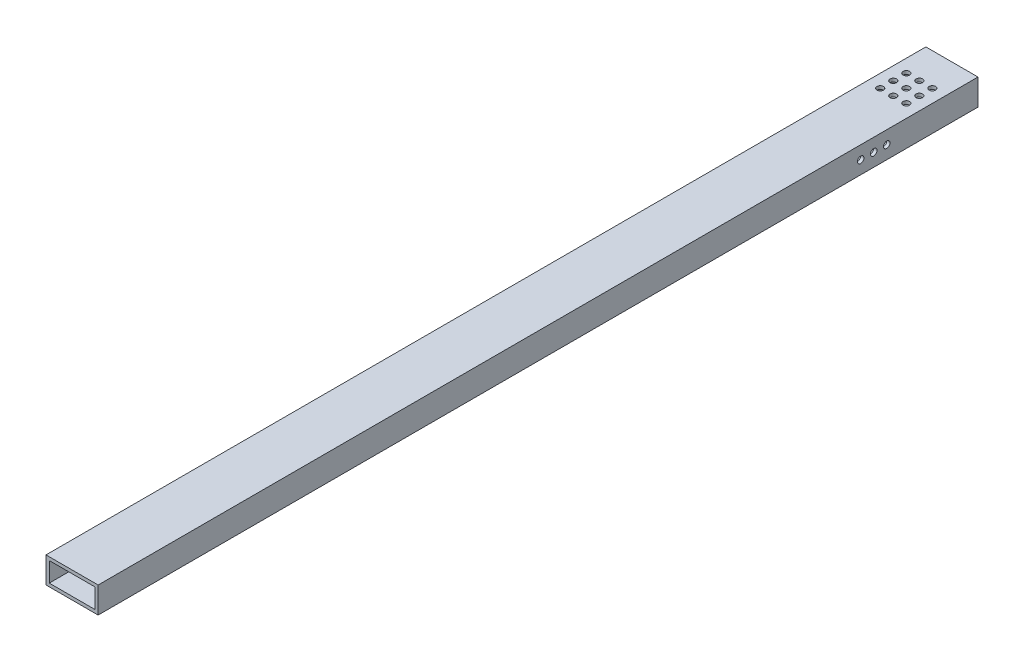
ISO-10303-21;
HEADER;
FILE_DESCRIPTION(('STEP AP214'),'2;1');
FILE_NAME('part.step','',(''),(''),'','','');
FILE_SCHEMA(('AUTOMOTIVE_DESIGN { 1 0 10303 214 1 1 1 1 }'));
ENDSEC;
DATA;
#1=APPLICATION_CONTEXT('core data for automotive mechanical design processes');
#2=APPLICATION_PROTOCOL_DEFINITION('international standard','automotive_design',2000,#1);
#3=PRODUCT_CONTEXT('',#1,'mechanical');
#4=PRODUCT('Part','Part','',(#3));
#5=PRODUCT_RELATED_PRODUCT_CATEGORY('part','',(#4));
#6=PRODUCT_DEFINITION_FORMATION('','',#4);
#7=PRODUCT_DEFINITION_CONTEXT('part definition',#1,'design');
#8=PRODUCT_DEFINITION('design','',#6,#7);
#9=PRODUCT_DEFINITION_SHAPE('','',#8);
#10=(LENGTH_UNIT() NAMED_UNIT(*) SI_UNIT(.MILLI.,.METRE.));
#11=(NAMED_UNIT(*) PLANE_ANGLE_UNIT() SI_UNIT($,.RADIAN.));
#12=(NAMED_UNIT(*) SI_UNIT($,.STERADIAN.) SOLID_ANGLE_UNIT());
#13=UNCERTAINTY_MEASURE_WITH_UNIT(LENGTH_MEASURE(1.E-05),#10,'distance_accuracy_value','');
#14=(GEOMETRIC_REPRESENTATION_CONTEXT(3) GLOBAL_UNCERTAINTY_ASSIGNED_CONTEXT((#13)) GLOBAL_UNIT_ASSIGNED_CONTEXT((#10,
#11,#12)) REPRESENTATION_CONTEXT('',''));
#15=CARTESIAN_POINT('',(0.,0.,0.));
#16=DIRECTION('',(0.,0.,1.));
#17=DIRECTION('',(1.,0.,0.));
#18=AXIS2_PLACEMENT_3D('',#15,#16,#17);
#19=CARTESIAN_POINT('',(0.,0.,857.25));
#20=DIRECTION('',(0.,0.,-1.));
#21=DIRECTION('',(-1.,0.,0.));
#22=AXIS2_PLACEMENT_3D('',#19,#20,#21);
#23=PLANE('',#22);
#24=DIRECTION('',(0.,-1.,0.));
#25=VECTOR('',#24,1.);
#26=CARTESIAN_POINT('',(0.,0.,857.25));
#27=LINE('',#26,#25);
#28=CARTESIAN_POINT('',(0.,25.4,857.25));
#29=VERTEX_POINT('',#28);
#30=CARTESIAN_POINT('',(0.,0.,857.25));
#31=VERTEX_POINT('',#30);
#32=EDGE_CURVE('E144',#29,#31,#27,.T.);
#33=ORIENTED_EDGE('',*,*,#32,.T.);
#34=DIRECTION('',(1.,0.,0.));
#35=VECTOR('',#34,1.);
#36=CARTESIAN_POINT('',(0.,0.,857.25));
#37=LINE('',#36,#35);
#38=CARTESIAN_POINT('',(50.8,0.,857.25));
#39=VERTEX_POINT('',#38);
#40=EDGE_CURVE('E147',#31,#39,#37,.T.);
#41=ORIENTED_EDGE('',*,*,#40,.T.);
#42=DIRECTION('',(0.,1.,0.));
#43=VECTOR('',#42,1.);
#44=CARTESIAN_POINT('',(50.8,0.,857.25));
#45=LINE('',#44,#43);
#46=CARTESIAN_POINT('',(50.8,25.4,857.25));
#47=VERTEX_POINT('',#46);
#48=EDGE_CURVE('E150',#39,#47,#45,.T.);
#49=ORIENTED_EDGE('',*,*,#48,.T.);
#50=DIRECTION('',(-1.,0.,0.));
#51=VECTOR('',#50,1.);
#52=CARTESIAN_POINT('',(0.,25.4,857.25));
#53=LINE('',#52,#51);
#54=EDGE_CURVE('E152',#47,#29,#53,.T.);
#55=ORIENTED_EDGE('',*,*,#54,.T.);
#56=EDGE_LOOP('',(#33,#41,#49,#55));
#57=FACE_BOUND('',#56,.T.);
#58=DIRECTION('',(0.,-1.,0.));
#59=VECTOR('',#58,1.);
#60=CARTESIAN_POINT('',(3.175,3.175,857.25));
#61=LINE('',#60,#59);
#62=CARTESIAN_POINT('',(3.175,22.225,857.25));
#63=VERTEX_POINT('',#62);
#64=CARTESIAN_POINT('',(3.175,3.175,857.25));
#65=VERTEX_POINT('',#64);
#66=EDGE_CURVE('E106',#63,#65,#61,.T.);
#67=ORIENTED_EDGE('',*,*,#66,.F.);
#68=DIRECTION('',(-1.,0.,0.));
#69=VECTOR('',#68,1.);
#70=CARTESIAN_POINT('',(3.175,22.225,857.25));
#71=LINE('',#70,#69);
#72=CARTESIAN_POINT('',(47.625,22.225,857.25));
#73=VERTEX_POINT('',#72);
#74=EDGE_CURVE('E128',#73,#63,#71,.T.);
#75=ORIENTED_EDGE('',*,*,#74,.F.);
#76=DIRECTION('',(0.,1.,0.));
#77=VECTOR('',#76,1.);
#78=CARTESIAN_POINT('',(47.625,3.175,857.25));
#79=LINE('',#78,#77);
#80=CARTESIAN_POINT('',(47.625,3.175,857.25));
#81=VERTEX_POINT('',#80);
#82=EDGE_CURVE('E126',#81,#73,#79,.T.);
#83=ORIENTED_EDGE('',*,*,#82,.F.);
#84=DIRECTION('',(1.,0.,0.));
#85=VECTOR('',#84,1.);
#86=CARTESIAN_POINT('',(3.175,3.175,857.25));
#87=LINE('',#86,#85);
#88=EDGE_CURVE('E114',#65,#81,#87,.T.);
#89=ORIENTED_EDGE('',*,*,#88,.F.);
#90=EDGE_LOOP('',(#67,#75,#83,#89));
#91=FACE_BOUND('',#90,.T.);
#92=ADVANCED_FACE('F39',(#57,#91),#23,.F.);
#93=CARTESIAN_POINT('',(0.,0.,0.));
#94=DIRECTION('',(0.,0.,-1.));
#95=DIRECTION('',(-1.,0.,0.));
#96=AXIS2_PLACEMENT_3D('',#93,#94,#95);
#97=PLANE('',#96);
#98=DIRECTION('',(0.,-1.,0.));
#99=VECTOR('',#98,1.);
#100=CARTESIAN_POINT('',(0.,0.,0.));
#101=LINE('',#100,#99);
#102=CARTESIAN_POINT('',(0.,25.4,0.));
#103=VERTEX_POINT('',#102);
#104=CARTESIAN_POINT('',(0.,0.,0.));
#105=VERTEX_POINT('',#104);
#106=EDGE_CURVE('E122',#103,#105,#101,.T.);
#107=ORIENTED_EDGE('',*,*,#106,.F.);
#108=DIRECTION('',(-1.,0.,0.));
#109=VECTOR('',#108,1.);
#110=CARTESIAN_POINT('',(0.,25.4,0.));
#111=LINE('',#110,#109);
#112=CARTESIAN_POINT('',(50.8,25.4,0.));
#113=VERTEX_POINT('',#112);
#114=EDGE_CURVE('E148',#113,#103,#111,.T.);
#115=ORIENTED_EDGE('',*,*,#114,.F.);
#116=DIRECTION('',(0.,1.,0.));
#117=VECTOR('',#116,1.);
#118=CARTESIAN_POINT('',(50.8,0.,0.));
#119=LINE('',#118,#117);
#120=CARTESIAN_POINT('',(50.8,0.,0.));
#121=VERTEX_POINT('',#120);
#122=EDGE_CURVE('E159',#121,#113,#119,.T.);
#123=ORIENTED_EDGE('',*,*,#122,.F.);
#124=DIRECTION('',(1.,0.,0.));
#125=VECTOR('',#124,1.);
#126=CARTESIAN_POINT('',(0.,0.,0.));
#127=LINE('',#126,#125);
#128=EDGE_CURVE('E157',#105,#121,#127,.T.);
#129=ORIENTED_EDGE('',*,*,#128,.F.);
#130=EDGE_LOOP('',(#107,#115,#123,#129));
#131=FACE_BOUND('',#130,.T.);
#132=DIRECTION('',(-1.,0.,0.));
#133=VECTOR('',#132,1.);
#134=CARTESIAN_POINT('',(3.175,22.225,0.));
#135=LINE('',#134,#133);
#136=CARTESIAN_POINT('',(47.625,22.225,0.));
#137=VERTEX_POINT('',#136);
#138=CARTESIAN_POINT('',(3.175,22.225,0.));
#139=VERTEX_POINT('',#138);
#140=EDGE_CURVE('E115',#137,#139,#135,.T.);
#141=ORIENTED_EDGE('',*,*,#140,.T.);
#142=DIRECTION('',(0.,-1.,0.));
#143=VECTOR('',#142,1.);
#144=CARTESIAN_POINT('',(3.175,3.175,0.));
#145=LINE('',#144,#143);
#146=CARTESIAN_POINT('',(3.175,3.175,0.));
#147=VERTEX_POINT('',#146);
#148=EDGE_CURVE('E64',#139,#147,#145,.T.);
#149=ORIENTED_EDGE('',*,*,#148,.T.);
#150=DIRECTION('',(1.,0.,0.));
#151=VECTOR('',#150,1.);
#152=CARTESIAN_POINT('',(3.175,3.175,0.));
#153=LINE('',#152,#151);
#154=CARTESIAN_POINT('',(47.625,3.175,0.));
#155=VERTEX_POINT('',#154);
#156=EDGE_CURVE('E121',#147,#155,#153,.T.);
#157=ORIENTED_EDGE('',*,*,#156,.T.);
#158=DIRECTION('',(0.,1.,0.));
#159=VECTOR('',#158,1.);
#160=CARTESIAN_POINT('',(47.625,3.175,0.));
#161=LINE('',#160,#159);
#162=EDGE_CURVE('E136',#155,#137,#161,.T.);
#163=ORIENTED_EDGE('',*,*,#162,.T.);
#164=EDGE_LOOP('',(#141,#149,#157,#163));
#165=FACE_BOUND('',#164,.T.);
#166=ADVANCED_FACE('F272',(#131,#165),#97,.T.);
#167=CARTESIAN_POINT('',(0.,0.,857.25));
#168=DIRECTION('',(1.,0.,0.));
#169=DIRECTION('',(0.,0.,-1.));
#170=AXIS2_PLACEMENT_3D('',#167,#168,#169);
#171=PLANE('',#170);
#172=CARTESIAN_POINT('',(0.,12.7,88.9));
#173=DIRECTION('',(1.,0.,0.));
#174=DIRECTION('',(0.,0.,-1.));
#175=AXIS2_PLACEMENT_3D('',#172,#173,#174);
#176=CIRCLE('',#175,3.175);
#177=CARTESIAN_POINT('',(0.,12.7,85.725));
#178=VERTEX_POINT('',#177);
#179=EDGE_CURVE('E173',#178,#178,#176,.T.);
#180=ORIENTED_EDGE('',*,*,#179,.T.);
#181=EDGE_LOOP('',(#180));
#182=FACE_BOUND('',#181,.T.);
#183=CARTESIAN_POINT('',(0.,12.6999999999999,101.6));
#184=DIRECTION('',(1.,0.,0.));
#185=DIRECTION('',(0.,0.,-1.));
#186=AXIS2_PLACEMENT_3D('',#183,#184,#185);
#187=CIRCLE('',#186,3.175);
#188=CARTESIAN_POINT('',(0.,12.6999999999999,98.425));
#189=VERTEX_POINT('',#188);
#190=EDGE_CURVE('E235',#189,#189,#187,.T.);
#191=ORIENTED_EDGE('',*,*,#190,.T.);
#192=EDGE_LOOP('',(#191));
#193=FACE_BOUND('',#192,.T.);
#194=CARTESIAN_POINT('',(0.,12.6999999999998,114.3));
#195=DIRECTION('',(1.,0.,0.));
#196=DIRECTION('',(0.,0.,-1.));
#197=AXIS2_PLACEMENT_3D('',#194,#195,#196);
#198=CIRCLE('',#197,3.175);
#199=CARTESIAN_POINT('',(0.,12.6999999999998,111.125));
#200=VERTEX_POINT('',#199);
#201=EDGE_CURVE('E226',#200,#200,#198,.T.);
#202=ORIENTED_EDGE('',*,*,#201,.T.);
#203=EDGE_LOOP('',(#202));
#204=FACE_BOUND('',#203,.T.);
#205=ORIENTED_EDGE('',*,*,#106,.T.);
#206=DIRECTION('',(0.,0.,-1.));
#207=VECTOR('',#206,1.);
#208=CARTESIAN_POINT('',(0.,0.,857.25));
#209=LINE('',#208,#207);
#210=EDGE_CURVE('E11',#31,#105,#209,.T.);
#211=ORIENTED_EDGE('',*,*,#210,.F.);
#212=ORIENTED_EDGE('',*,*,#32,.F.);
#213=DIRECTION('',(0.,0.,-1.));
#214=VECTOR('',#213,1.);
#215=CARTESIAN_POINT('',(0.,25.4,857.25));
#216=LINE('',#215,#214);
#217=EDGE_CURVE('E154',#29,#103,#216,.T.);
#218=ORIENTED_EDGE('',*,*,#217,.T.);
#219=EDGE_LOOP('',(#205,#211,#212,#218));
#220=FACE_BOUND('',#219,.T.);
#221=ADVANCED_FACE('F41',(#182,#193,#204,#220),#171,.F.);
#222=CARTESIAN_POINT('',(0.,0.,857.25));
#223=DIRECTION('',(0.,1.,0.));
#224=DIRECTION('',(0.,0.,1.));
#225=AXIS2_PLACEMENT_3D('',#222,#223,#224);
#226=PLANE('',#225);
#227=CARTESIAN_POINT('',(25.4,0.,31.75));
#228=DIRECTION('',(0.,1.,0.));
#229=DIRECTION('',(0.,0.,1.));
#230=AXIS2_PLACEMENT_3D('',#227,#228,#229);
#231=CIRCLE('',#230,3.175);
#232=CARTESIAN_POINT('',(25.4,0.,34.925));
#233=VERTEX_POINT('',#232);
#234=EDGE_CURVE('E419',#233,#233,#231,.T.);
#235=ORIENTED_EDGE('',*,*,#234,.T.);
#236=EDGE_LOOP('',(#235));
#237=FACE_BOUND('',#236,.T.);
#238=CARTESIAN_POINT('',(38.1,0.,31.75));
#239=DIRECTION('',(0.,1.,0.));
#240=DIRECTION('',(0.,0.,1.));
#241=AXIS2_PLACEMENT_3D('',#238,#239,#240);
#242=CIRCLE('',#241,3.175);
#243=CARTESIAN_POINT('',(38.1,0.,34.925));
#244=VERTEX_POINT('',#243);
#245=EDGE_CURVE('E425',#244,#244,#242,.T.);
#246=ORIENTED_EDGE('',*,*,#245,.T.);
#247=EDGE_LOOP('',(#246));
#248=FACE_BOUND('',#247,.T.);
#249=CARTESIAN_POINT('',(25.4,0.,44.45));
#250=DIRECTION('',(0.,1.,0.));
#251=DIRECTION('',(0.,0.,1.));
#252=AXIS2_PLACEMENT_3D('',#249,#250,#251);
#253=CIRCLE('',#252,3.175);
#254=CARTESIAN_POINT('',(25.4,0.,47.625));
#255=VERTEX_POINT('',#254);
#256=EDGE_CURVE('E431',#255,#255,#253,.T.);
#257=ORIENTED_EDGE('',*,*,#256,.T.);
#258=EDGE_LOOP('',(#257));
#259=FACE_BOUND('',#258,.T.);
#260=CARTESIAN_POINT('',(38.1,0.,44.45));
#261=DIRECTION('',(0.,1.,0.));
#262=DIRECTION('',(0.,0.,1.));
#263=AXIS2_PLACEMENT_3D('',#260,#261,#262);
#264=CIRCLE('',#263,3.175);
#265=CARTESIAN_POINT('',(38.1,0.,47.625));
#266=VERTEX_POINT('',#265);
#267=EDGE_CURVE('E395',#266,#266,#264,.T.);
#268=ORIENTED_EDGE('',*,*,#267,.T.);
#269=EDGE_LOOP('',(#268));
#270=FACE_BOUND('',#269,.T.);
#271=CARTESIAN_POINT('',(25.4,0.,57.15));
#272=DIRECTION('',(0.,1.,0.));
#273=DIRECTION('',(0.,0.,1.));
#274=AXIS2_PLACEMENT_3D('',#271,#272,#273);
#275=CIRCLE('',#274,3.17500000000001);
#276=CARTESIAN_POINT('',(25.4,0.,60.325));
#277=VERTEX_POINT('',#276);
#278=EDGE_CURVE('E389',#277,#277,#275,.T.);
#279=ORIENTED_EDGE('',*,*,#278,.T.);
#280=EDGE_LOOP('',(#279));
#281=FACE_BOUND('',#280,.T.);
#282=CARTESIAN_POINT('',(38.1,0.,57.15));
#283=DIRECTION('',(0.,1.,0.));
#284=DIRECTION('',(0.,0.,1.));
#285=AXIS2_PLACEMENT_3D('',#282,#283,#284);
#286=CIRCLE('',#285,3.175);
#287=CARTESIAN_POINT('',(38.1,0.,60.325));
#288=VERTEX_POINT('',#287);
#289=EDGE_CURVE('E398',#288,#288,#286,.T.);
#290=ORIENTED_EDGE('',*,*,#289,.T.);
#291=EDGE_LOOP('',(#290));
#292=FACE_BOUND('',#291,.T.);
#293=CARTESIAN_POINT('',(12.7,0.,44.45));
#294=DIRECTION('',(0.,1.,0.));
#295=DIRECTION('',(0.,0.,1.));
#296=AXIS2_PLACEMENT_3D('',#293,#294,#295);
#297=CIRCLE('',#296,3.175);
#298=CARTESIAN_POINT('',(12.7,0.,47.625));
#299=VERTEX_POINT('',#298);
#300=EDGE_CURVE('E406',#299,#299,#297,.T.);
#301=ORIENTED_EDGE('',*,*,#300,.T.);
#302=EDGE_LOOP('',(#301));
#303=FACE_BOUND('',#302,.T.);
#304=CARTESIAN_POINT('',(12.7,0.,57.15));
#305=DIRECTION('',(0.,1.,0.));
#306=DIRECTION('',(0.,0.,1.));
#307=AXIS2_PLACEMENT_3D('',#304,#305,#306);
#308=CIRCLE('',#307,3.175);
#309=CARTESIAN_POINT('',(12.7,0.,60.325));
#310=VERTEX_POINT('',#309);
#311=EDGE_CURVE('E412',#310,#310,#308,.T.);
#312=ORIENTED_EDGE('',*,*,#311,.T.);
#313=EDGE_LOOP('',(#312));
#314=FACE_BOUND('',#313,.T.);
#315=CARTESIAN_POINT('',(12.7,0.,31.75));
#316=DIRECTION('',(0.,1.,0.));
#317=DIRECTION('',(0.,0.,1.));
#318=AXIS2_PLACEMENT_3D('',#315,#316,#317);
#319=CIRCLE('',#318,3.175);
#320=CARTESIAN_POINT('',(12.7,0.,34.925));
#321=VERTEX_POINT('',#320);
#322=EDGE_CURVE('E185',#321,#321,#319,.T.);
#323=ORIENTED_EDGE('',*,*,#322,.T.);
#324=EDGE_LOOP('',(#323));
#325=FACE_BOUND('',#324,.T.);
#326=ORIENTED_EDGE('',*,*,#128,.T.);
#327=DIRECTION('',(0.,0.,-1.));
#328=VECTOR('',#327,1.);
#329=CARTESIAN_POINT('',(50.8,0.,857.25));
#330=LINE('',#329,#328);
#331=EDGE_CURVE('E48',#39,#121,#330,.T.);
#332=ORIENTED_EDGE('',*,*,#331,.F.);
#333=ORIENTED_EDGE('',*,*,#40,.F.);
#334=ORIENTED_EDGE('',*,*,#210,.T.);
#335=EDGE_LOOP('',(#326,#332,#333,#334));
#336=FACE_BOUND('',#335,.T.);
#337=ADVANCED_FACE('F271',(#237,#248,#259,#270,#281,#292,#303,#314,#325,#336),#226,.F.);
#338=CARTESIAN_POINT('',(50.8,0.,857.25));
#339=DIRECTION('',(-1.,0.,0.));
#340=DIRECTION('',(0.,0.,1.));
#341=AXIS2_PLACEMENT_3D('',#338,#339,#340);
#342=PLANE('',#341);
#343=CARTESIAN_POINT('',(50.8,12.7,88.9));
#344=DIRECTION('',(1.,0.,0.));
#345=DIRECTION('',(0.,0.,-1.));
#346=AXIS2_PLACEMENT_3D('',#343,#344,#345);
#347=CIRCLE('',#346,3.175);
#348=CARTESIAN_POINT('',(50.8,12.7,85.725));
#349=VERTEX_POINT('',#348);
#350=EDGE_CURVE('E229',#349,#349,#347,.T.);
#351=ORIENTED_EDGE('',*,*,#350,.F.);
#352=EDGE_LOOP('',(#351));
#353=FACE_BOUND('',#352,.T.);
#354=CARTESIAN_POINT('',(50.8,12.6999999999999,101.6));
#355=DIRECTION('',(1.,0.,0.));
#356=DIRECTION('',(0.,0.,-1.));
#357=AXIS2_PLACEMENT_3D('',#354,#355,#356);
#358=CIRCLE('',#357,3.175);
#359=CARTESIAN_POINT('',(50.8,12.6999999999999,98.425));
#360=VERTEX_POINT('',#359);
#361=EDGE_CURVE('E232',#360,#360,#358,.T.);
#362=ORIENTED_EDGE('',*,*,#361,.F.);
#363=EDGE_LOOP('',(#362));
#364=FACE_BOUND('',#363,.T.);
#365=CARTESIAN_POINT('',(50.8,12.6999999999998,114.3));
#366=DIRECTION('',(1.,0.,0.));
#367=DIRECTION('',(0.,0.,-1.));
#368=AXIS2_PLACEMENT_3D('',#365,#366,#367);
#369=CIRCLE('',#368,3.175);
#370=CARTESIAN_POINT('',(50.8,12.6999999999998,111.125));
#371=VERTEX_POINT('',#370);
#372=EDGE_CURVE('E238',#371,#371,#369,.T.);
#373=ORIENTED_EDGE('',*,*,#372,.F.);
#374=EDGE_LOOP('',(#373));
#375=FACE_BOUND('',#374,.T.);
#376=ORIENTED_EDGE('',*,*,#122,.T.);
#377=DIRECTION('',(0.,0.,-1.));
#378=VECTOR('',#377,1.);
#379=CARTESIAN_POINT('',(50.8,25.4,857.25));
#380=LINE('',#379,#378);
#381=EDGE_CURVE('E164',#47,#113,#380,.T.);
#382=ORIENTED_EDGE('',*,*,#381,.F.);
#383=ORIENTED_EDGE('',*,*,#48,.F.);
#384=ORIENTED_EDGE('',*,*,#331,.T.);
#385=EDGE_LOOP('',(#376,#382,#383,#384));
#386=FACE_BOUND('',#385,.T.);
#387=ADVANCED_FACE('F290',(#353,#364,#375,#386),#342,.F.);
#388=CARTESIAN_POINT('',(0.,25.4,857.25));
#389=DIRECTION('',(0.,-1.,0.));
#390=DIRECTION('',(0.,0.,-1.));
#391=AXIS2_PLACEMENT_3D('',#388,#389,#390);
#392=PLANE('',#391);
#393=CARTESIAN_POINT('',(25.4,25.4,31.75));
#394=DIRECTION('',(0.,1.,0.));
#395=DIRECTION('',(0.,0.,1.));
#396=AXIS2_PLACEMENT_3D('',#393,#394,#395);
#397=CIRCLE('',#396,3.175);
#398=CARTESIAN_POINT('',(25.4,25.4,34.925));
#399=VERTEX_POINT('',#398);
#400=EDGE_CURVE('E415',#399,#399,#397,.T.);
#401=ORIENTED_EDGE('',*,*,#400,.F.);
#402=EDGE_LOOP('',(#401));
#403=FACE_BOUND('',#402,.T.);
#404=CARTESIAN_POINT('',(38.1,25.4,31.75));
#405=DIRECTION('',(0.,1.,0.));
#406=DIRECTION('',(0.,0.,1.));
#407=AXIS2_PLACEMENT_3D('',#404,#405,#406);
#408=CIRCLE('',#407,3.175);
#409=CARTESIAN_POINT('',(38.1,25.4,34.925));
#410=VERTEX_POINT('',#409);
#411=EDGE_CURVE('E422',#410,#410,#408,.T.);
#412=ORIENTED_EDGE('',*,*,#411,.F.);
#413=EDGE_LOOP('',(#412));
#414=FACE_BOUND('',#413,.T.);
#415=CARTESIAN_POINT('',(25.4,25.4,44.45));
#416=DIRECTION('',(0.,1.,0.));
#417=DIRECTION('',(0.,0.,1.));
#418=AXIS2_PLACEMENT_3D('',#415,#416,#417);
#419=CIRCLE('',#418,3.175);
#420=CARTESIAN_POINT('',(25.4,25.4,47.625));
#421=VERTEX_POINT('',#420);
#422=EDGE_CURVE('E428',#421,#421,#419,.T.);
#423=ORIENTED_EDGE('',*,*,#422,.F.);
#424=EDGE_LOOP('',(#423));
#425=FACE_BOUND('',#424,.T.);
#426=CARTESIAN_POINT('',(38.1,25.4,44.45));
#427=DIRECTION('',(0.,1.,0.));
#428=DIRECTION('',(0.,0.,1.));
#429=AXIS2_PLACEMENT_3D('',#426,#427,#428);
#430=CIRCLE('',#429,3.175);
#431=CARTESIAN_POINT('',(38.1,25.4,47.625));
#432=VERTEX_POINT('',#431);
#433=EDGE_CURVE('E434',#432,#432,#430,.T.);
#434=ORIENTED_EDGE('',*,*,#433,.F.);
#435=EDGE_LOOP('',(#434));
#436=FACE_BOUND('',#435,.T.);
#437=CARTESIAN_POINT('',(25.4,25.4,57.15));
#438=DIRECTION('',(0.,1.,0.));
#439=DIRECTION('',(0.,0.,1.));
#440=AXIS2_PLACEMENT_3D('',#437,#438,#439);
#441=CIRCLE('',#440,3.17500000000001);
#442=CARTESIAN_POINT('',(25.4,25.4,60.325));
#443=VERTEX_POINT('',#442);
#444=EDGE_CURVE('E391',#443,#443,#441,.T.);
#445=ORIENTED_EDGE('',*,*,#444,.F.);
#446=EDGE_LOOP('',(#445));
#447=FACE_BOUND('',#446,.T.);
#448=CARTESIAN_POINT('',(38.1,25.4,57.15));
#449=DIRECTION('',(0.,1.,0.));
#450=DIRECTION('',(0.,0.,1.));
#451=AXIS2_PLACEMENT_3D('',#448,#449,#450);
#452=CIRCLE('',#451,3.175);
#453=CARTESIAN_POINT('',(38.1,25.4,60.325));
#454=VERTEX_POINT('',#453);
#455=EDGE_CURVE('E392',#454,#454,#452,.T.);
#456=ORIENTED_EDGE('',*,*,#455,.F.);
#457=EDGE_LOOP('',(#456));
#458=FACE_BOUND('',#457,.T.);
#459=CARTESIAN_POINT('',(12.7,25.4,44.45));
#460=DIRECTION('',(0.,1.,0.));
#461=DIRECTION('',(0.,0.,1.));
#462=AXIS2_PLACEMENT_3D('',#459,#460,#461);
#463=CIRCLE('',#462,3.175);
#464=CARTESIAN_POINT('',(12.7,25.4,47.625));
#465=VERTEX_POINT('',#464);
#466=EDGE_CURVE('E403',#465,#465,#463,.T.);
#467=ORIENTED_EDGE('',*,*,#466,.F.);
#468=EDGE_LOOP('',(#467));
#469=FACE_BOUND('',#468,.T.);
#470=CARTESIAN_POINT('',(12.7,25.4,57.15));
#471=DIRECTION('',(0.,1.,0.));
#472=DIRECTION('',(0.,0.,1.));
#473=AXIS2_PLACEMENT_3D('',#470,#471,#472);
#474=CIRCLE('',#473,3.175);
#475=CARTESIAN_POINT('',(12.7,25.4,60.325));
#476=VERTEX_POINT('',#475);
#477=EDGE_CURVE('E409',#476,#476,#474,.T.);
#478=ORIENTED_EDGE('',*,*,#477,.F.);
#479=EDGE_LOOP('',(#478));
#480=FACE_BOUND('',#479,.T.);
#481=CARTESIAN_POINT('',(12.7,25.4,31.75));
#482=DIRECTION('',(0.,1.,0.));
#483=DIRECTION('',(0.,0.,1.));
#484=AXIS2_PLACEMENT_3D('',#481,#482,#483);
#485=CIRCLE('',#484,3.175);
#486=CARTESIAN_POINT('',(12.7,25.4,34.925));
#487=VERTEX_POINT('',#486);
#488=EDGE_CURVE('E418',#487,#487,#485,.T.);
#489=ORIENTED_EDGE('',*,*,#488,.F.);
#490=EDGE_LOOP('',(#489));
#491=FACE_BOUND('',#490,.T.);
#492=ORIENTED_EDGE('',*,*,#114,.T.);
#493=ORIENTED_EDGE('',*,*,#217,.F.);
#494=ORIENTED_EDGE('',*,*,#54,.F.);
#495=ORIENTED_EDGE('',*,*,#381,.T.);
#496=EDGE_LOOP('',(#492,#493,#494,#495));
#497=FACE_BOUND('',#496,.T.);
#498=ADVANCED_FACE('F254',(#403,#414,#425,#436,#447,#458,#469,#480,#491,#497),#392,.F.);
#499=CARTESIAN_POINT('',(3.175,3.175,857.25));
#500=DIRECTION('',(1.,0.,0.));
#501=DIRECTION('',(0.,0.,-1.));
#502=AXIS2_PLACEMENT_3D('',#499,#500,#501);
#503=PLANE('',#502);
#504=CARTESIAN_POINT('',(3.175,12.7,88.9));
#505=DIRECTION('',(1.,0.,0.));
#506=DIRECTION('',(0.,0.,-1.));
#507=AXIS2_PLACEMENT_3D('',#504,#505,#506);
#508=CIRCLE('',#507,3.175);
#509=CARTESIAN_POINT('',(3.175,12.7,85.725));
#510=VERTEX_POINT('',#509);
#511=EDGE_CURVE('E134',#510,#510,#508,.T.);
#512=ORIENTED_EDGE('',*,*,#511,.F.);
#513=EDGE_LOOP('',(#512));
#514=FACE_BOUND('',#513,.T.);
#515=CARTESIAN_POINT('',(3.175,12.6999999999999,101.6));
#516=DIRECTION('',(1.,0.,0.));
#517=DIRECTION('',(0.,0.,-1.));
#518=AXIS2_PLACEMENT_3D('',#515,#516,#517);
#519=CIRCLE('',#518,3.175);
#520=CARTESIAN_POINT('',(3.175,12.6999999999999,98.425));
#521=VERTEX_POINT('',#520);
#522=EDGE_CURVE('E177',#521,#521,#519,.T.);
#523=ORIENTED_EDGE('',*,*,#522,.F.);
#524=EDGE_LOOP('',(#523));
#525=FACE_BOUND('',#524,.T.);
#526=CARTESIAN_POINT('',(3.175,12.6999999999998,114.3));
#527=DIRECTION('',(1.,0.,0.));
#528=DIRECTION('',(0.,0.,-1.));
#529=AXIS2_PLACEMENT_3D('',#526,#527,#528);
#530=CIRCLE('',#529,3.175);
#531=CARTESIAN_POINT('',(3.175,12.6999999999998,111.125));
#532=VERTEX_POINT('',#531);
#533=EDGE_CURVE('E172',#532,#532,#530,.T.);
#534=ORIENTED_EDGE('',*,*,#533,.F.);
#535=EDGE_LOOP('',(#534));
#536=FACE_BOUND('',#535,.T.);
#537=ORIENTED_EDGE('',*,*,#148,.F.);
#538=DIRECTION('',(0.,0.,-1.));
#539=VECTOR('',#538,1.);
#540=CARTESIAN_POINT('',(3.175,22.225,857.25));
#541=LINE('',#540,#539);
#542=EDGE_CURVE('E110',#63,#139,#541,.T.);
#543=ORIENTED_EDGE('',*,*,#542,.F.);
#544=ORIENTED_EDGE('',*,*,#66,.T.);
#545=DIRECTION('',(0.,0.,-1.));
#546=VECTOR('',#545,1.);
#547=CARTESIAN_POINT('',(3.175,3.175,857.25));
#548=LINE('',#547,#546);
#549=EDGE_CURVE('E109',#65,#147,#548,.T.);
#550=ORIENTED_EDGE('',*,*,#549,.T.);
#551=EDGE_LOOP('',(#537,#543,#544,#550));
#552=FACE_BOUND('',#551,.T.);
#553=ADVANCED_FACE('F108',(#514,#525,#536,#552),#503,.T.);
#554=CARTESIAN_POINT('',(3.175,3.175,857.25));
#555=DIRECTION('',(0.,1.,0.));
#556=DIRECTION('',(0.,0.,1.));
#557=AXIS2_PLACEMENT_3D('',#554,#555,#556);
#558=PLANE('',#557);
#559=CARTESIAN_POINT('',(25.4,3.175,31.75));
#560=DIRECTION('',(0.,1.,0.));
#561=DIRECTION('',(0.,0.,1.));
#562=AXIS2_PLACEMENT_3D('',#559,#560,#561);
#563=CIRCLE('',#562,3.175);
#564=CARTESIAN_POINT('',(25.4,3.175,34.925));
#565=VERTEX_POINT('',#564);
#566=EDGE_CURVE('E223',#565,#565,#563,.T.);
#567=ORIENTED_EDGE('',*,*,#566,.F.);
#568=EDGE_LOOP('',(#567));
#569=FACE_BOUND('',#568,.T.);
#570=CARTESIAN_POINT('',(38.1,3.175,31.75));
#571=DIRECTION('',(0.,1.,0.));
#572=DIRECTION('',(0.,0.,1.));
#573=AXIS2_PLACEMENT_3D('',#570,#571,#572);
#574=CIRCLE('',#573,3.175);
#575=CARTESIAN_POINT('',(38.1,3.175,34.925));
#576=VERTEX_POINT('',#575);
#577=EDGE_CURVE('E211',#576,#576,#574,.T.);
#578=ORIENTED_EDGE('',*,*,#577,.F.);
#579=EDGE_LOOP('',(#578));
#580=FACE_BOUND('',#579,.T.);
#581=CARTESIAN_POINT('',(25.4,3.175,44.45));
#582=DIRECTION('',(0.,1.,0.));
#583=DIRECTION('',(0.,0.,1.));
#584=AXIS2_PLACEMENT_3D('',#581,#582,#583);
#585=CIRCLE('',#584,3.175);
#586=CARTESIAN_POINT('',(25.4,3.175,47.625));
#587=VERTEX_POINT('',#586);
#588=EDGE_CURVE('E208',#587,#587,#585,.T.);
#589=ORIENTED_EDGE('',*,*,#588,.F.);
#590=EDGE_LOOP('',(#589));
#591=FACE_BOUND('',#590,.T.);
#592=CARTESIAN_POINT('',(38.1,3.175,44.45));
#593=DIRECTION('',(0.,1.,0.));
#594=DIRECTION('',(0.,0.,1.));
#595=AXIS2_PLACEMENT_3D('',#592,#593,#594);
#596=CIRCLE('',#595,3.175);
#597=CARTESIAN_POINT('',(38.1,3.175,47.625));
#598=VERTEX_POINT('',#597);
#599=EDGE_CURVE('E205',#598,#598,#596,.T.);
#600=ORIENTED_EDGE('',*,*,#599,.F.);
#601=EDGE_LOOP('',(#600));
#602=FACE_BOUND('',#601,.T.);
#603=CARTESIAN_POINT('',(25.4,3.175,57.15));
#604=DIRECTION('',(0.,1.,0.));
#605=DIRECTION('',(0.,0.,1.));
#606=AXIS2_PLACEMENT_3D('',#603,#604,#605);
#607=CIRCLE('',#606,3.17500000000001);
#608=CARTESIAN_POINT('',(25.4,3.175,60.325));
#609=VERTEX_POINT('',#608);
#610=EDGE_CURVE('E201',#609,#609,#607,.T.);
#611=ORIENTED_EDGE('',*,*,#610,.F.);
#612=EDGE_LOOP('',(#611));
#613=FACE_BOUND('',#612,.T.);
#614=CARTESIAN_POINT('',(38.1,3.175,57.15));
#615=DIRECTION('',(0.,1.,0.));
#616=DIRECTION('',(0.,0.,1.));
#617=AXIS2_PLACEMENT_3D('',#614,#615,#616);
#618=CIRCLE('',#617,3.175);
#619=CARTESIAN_POINT('',(38.1,3.175,60.325));
#620=VERTEX_POINT('',#619);
#621=EDGE_CURVE('E197',#620,#620,#618,.T.);
#622=ORIENTED_EDGE('',*,*,#621,.F.);
#623=EDGE_LOOP('',(#622));
#624=FACE_BOUND('',#623,.T.);
#625=CARTESIAN_POINT('',(12.7,3.175,44.45));
#626=DIRECTION('',(0.,1.,0.));
#627=DIRECTION('',(0.,0.,1.));
#628=AXIS2_PLACEMENT_3D('',#625,#626,#627);
#629=CIRCLE('',#628,3.175);
#630=CARTESIAN_POINT('',(12.7,3.175,47.625));
#631=VERTEX_POINT('',#630);
#632=EDGE_CURVE('E193',#631,#631,#629,.T.);
#633=ORIENTED_EDGE('',*,*,#632,.F.);
#634=EDGE_LOOP('',(#633));
#635=FACE_BOUND('',#634,.T.);
#636=CARTESIAN_POINT('',(12.7,3.175,57.15));
#637=DIRECTION('',(0.,1.,0.));
#638=DIRECTION('',(0.,0.,1.));
#639=AXIS2_PLACEMENT_3D('',#636,#637,#638);
#640=CIRCLE('',#639,3.175);
#641=CARTESIAN_POINT('',(12.7,3.175,60.325));
#642=VERTEX_POINT('',#641);
#643=EDGE_CURVE('E189',#642,#642,#640,.T.);
#644=ORIENTED_EDGE('',*,*,#643,.F.);
#645=EDGE_LOOP('',(#644));
#646=FACE_BOUND('',#645,.T.);
#647=CARTESIAN_POINT('',(12.7,3.175,31.75));
#648=DIRECTION('',(0.,1.,0.));
#649=DIRECTION('',(0.,0.,1.));
#650=AXIS2_PLACEMENT_3D('',#647,#648,#649);
#651=CIRCLE('',#650,3.175);
#652=CARTESIAN_POINT('',(12.7,3.175,34.925));
#653=VERTEX_POINT('',#652);
#654=EDGE_CURVE('E184',#653,#653,#651,.T.);
#655=ORIENTED_EDGE('',*,*,#654,.F.);
#656=EDGE_LOOP('',(#655));
#657=FACE_BOUND('',#656,.T.);
#658=ORIENTED_EDGE('',*,*,#156,.F.);
#659=ORIENTED_EDGE('',*,*,#549,.F.);
#660=ORIENTED_EDGE('',*,*,#88,.T.);
#661=DIRECTION('',(0.,0.,-1.));
#662=VECTOR('',#661,1.);
#663=CARTESIAN_POINT('',(47.625,3.175,857.25));
#664=LINE('',#663,#662);
#665=EDGE_CURVE('E123',#81,#155,#664,.T.);
#666=ORIENTED_EDGE('',*,*,#665,.T.);
#667=EDGE_LOOP('',(#658,#659,#660,#666));
#668=FACE_BOUND('',#667,.T.);
#669=ADVANCED_FACE('F118',(#569,#580,#591,#602,#613,#624,#635,#646,#657,#668),#558,.T.);
#670=CARTESIAN_POINT('',(47.625,3.175,857.25));
#671=DIRECTION('',(-1.,0.,0.));
#672=DIRECTION('',(0.,0.,1.));
#673=AXIS2_PLACEMENT_3D('',#670,#671,#672);
#674=PLANE('',#673);
#675=CARTESIAN_POINT('',(47.625,12.7,88.9));
#676=DIRECTION('',(-1.,0.,0.));
#677=DIRECTION('',(0.,0.,1.));
#678=AXIS2_PLACEMENT_3D('',#675,#676,#677);
#679=CIRCLE('',#678,3.175);
#680=CARTESIAN_POINT('',(47.625,12.7,92.075));
#681=VERTEX_POINT('',#680);
#682=EDGE_CURVE('E178',#681,#681,#679,.T.);
#683=ORIENTED_EDGE('',*,*,#682,.F.);
#684=EDGE_LOOP('',(#683));
#685=FACE_BOUND('',#684,.T.);
#686=CARTESIAN_POINT('',(47.625,12.6999999999999,101.6));
#687=DIRECTION('',(-1.,0.,0.));
#688=DIRECTION('',(0.,0.,1.));
#689=AXIS2_PLACEMENT_3D('',#686,#687,#688);
#690=CIRCLE('',#689,3.175);
#691=CARTESIAN_POINT('',(47.625,12.6999999999999,104.775));
#692=VERTEX_POINT('',#691);
#693=EDGE_CURVE('E174',#692,#692,#690,.T.);
#694=ORIENTED_EDGE('',*,*,#693,.F.);
#695=EDGE_LOOP('',(#694));
#696=FACE_BOUND('',#695,.T.);
#697=CARTESIAN_POINT('',(47.625,12.6999999999998,114.3));
#698=DIRECTION('',(-1.,0.,0.));
#699=DIRECTION('',(0.,0.,1.));
#700=AXIS2_PLACEMENT_3D('',#697,#698,#699);
#701=CIRCLE('',#700,3.175);
#702=CARTESIAN_POINT('',(47.625,12.6999999999998,117.475));
#703=VERTEX_POINT('',#702);
#704=EDGE_CURVE('E169',#703,#703,#701,.T.);
#705=ORIENTED_EDGE('',*,*,#704,.F.);
#706=EDGE_LOOP('',(#705));
#707=FACE_BOUND('',#706,.T.);
#708=ORIENTED_EDGE('',*,*,#162,.F.);
#709=ORIENTED_EDGE('',*,*,#665,.F.);
#710=ORIENTED_EDGE('',*,*,#82,.T.);
#711=DIRECTION('',(0.,0.,-1.));
#712=VECTOR('',#711,1.);
#713=CARTESIAN_POINT('',(47.625,22.225,857.25));
#714=LINE('',#713,#712);
#715=EDGE_CURVE('E56',#73,#137,#714,.T.);
#716=ORIENTED_EDGE('',*,*,#715,.T.);
#717=EDGE_LOOP('',(#708,#709,#710,#716));
#718=FACE_BOUND('',#717,.T.);
#719=ADVANCED_FACE('F312',(#685,#696,#707,#718),#674,.T.);
#720=CARTESIAN_POINT('',(3.175,22.225,857.25));
#721=DIRECTION('',(0.,-1.,0.));
#722=DIRECTION('',(0.,0.,-1.));
#723=AXIS2_PLACEMENT_3D('',#720,#721,#722);
#724=PLANE('',#723);
#725=CARTESIAN_POINT('',(25.4,22.225,31.75));
#726=DIRECTION('',(0.,-1.,0.));
#727=DIRECTION('',(0.,0.,-1.));
#728=AXIS2_PLACEMENT_3D('',#725,#726,#727);
#729=CIRCLE('',#728,3.175);
#730=CARTESIAN_POINT('',(25.4,22.225,28.575));
#731=VERTEX_POINT('',#730);
#732=EDGE_CURVE('E43',#731,#731,#729,.T.);
#733=ORIENTED_EDGE('',*,*,#732,.F.);
#734=EDGE_LOOP('',(#733));
#735=FACE_BOUND('',#734,.T.);
#736=CARTESIAN_POINT('',(38.1,22.225,31.75));
#737=DIRECTION('',(0.,-1.,0.));
#738=DIRECTION('',(0.,0.,-1.));
#739=AXIS2_PLACEMENT_3D('',#736,#737,#738);
#740=CIRCLE('',#739,3.175);
#741=CARTESIAN_POINT('',(38.1,22.225,28.575));
#742=VERTEX_POINT('',#741);
#743=EDGE_CURVE('E209',#742,#742,#740,.T.);
#744=ORIENTED_EDGE('',*,*,#743,.F.);
#745=EDGE_LOOP('',(#744));
#746=FACE_BOUND('',#745,.T.);
#747=CARTESIAN_POINT('',(25.4,22.225,44.45));
#748=DIRECTION('',(0.,-1.,0.));
#749=DIRECTION('',(0.,0.,-1.));
#750=AXIS2_PLACEMENT_3D('',#747,#748,#749);
#751=CIRCLE('',#750,3.175);
#752=CARTESIAN_POINT('',(25.4,22.225,41.275));
#753=VERTEX_POINT('',#752);
#754=EDGE_CURVE('E206',#753,#753,#751,.T.);
#755=ORIENTED_EDGE('',*,*,#754,.F.);
#756=EDGE_LOOP('',(#755));
#757=FACE_BOUND('',#756,.T.);
#758=CARTESIAN_POINT('',(38.1,22.225,44.45));
#759=DIRECTION('',(0.,-1.,0.));
#760=DIRECTION('',(0.,0.,-1.));
#761=AXIS2_PLACEMENT_3D('',#758,#759,#760);
#762=CIRCLE('',#761,3.175);
#763=CARTESIAN_POINT('',(38.1,22.225,41.275));
#764=VERTEX_POINT('',#763);
#765=EDGE_CURVE('E202',#764,#764,#762,.T.);
#766=ORIENTED_EDGE('',*,*,#765,.F.);
#767=EDGE_LOOP('',(#766));
#768=FACE_BOUND('',#767,.T.);
#769=CARTESIAN_POINT('',(25.4,22.225,57.15));
#770=DIRECTION('',(0.,-1.,0.));
#771=DIRECTION('',(0.,0.,-1.));
#772=AXIS2_PLACEMENT_3D('',#769,#770,#771);
#773=CIRCLE('',#772,3.17500000000001);
#774=CARTESIAN_POINT('',(25.4,22.225,53.975));
#775=VERTEX_POINT('',#774);
#776=EDGE_CURVE('E198',#775,#775,#773,.T.);
#777=ORIENTED_EDGE('',*,*,#776,.F.);
#778=EDGE_LOOP('',(#777));
#779=FACE_BOUND('',#778,.T.);
#780=CARTESIAN_POINT('',(38.1,22.225,57.15));
#781=DIRECTION('',(0.,-1.,0.));
#782=DIRECTION('',(0.,0.,-1.));
#783=AXIS2_PLACEMENT_3D('',#780,#781,#782);
#784=CIRCLE('',#783,3.175);
#785=CARTESIAN_POINT('',(38.1,22.225,53.975));
#786=VERTEX_POINT('',#785);
#787=EDGE_CURVE('E194',#786,#786,#784,.T.);
#788=ORIENTED_EDGE('',*,*,#787,.F.);
#789=EDGE_LOOP('',(#788));
#790=FACE_BOUND('',#789,.T.);
#791=CARTESIAN_POINT('',(12.7,22.225,44.45));
#792=DIRECTION('',(0.,-1.,0.));
#793=DIRECTION('',(0.,0.,-1.));
#794=AXIS2_PLACEMENT_3D('',#791,#792,#793);
#795=CIRCLE('',#794,3.175);
#796=CARTESIAN_POINT('',(12.7,22.225,41.275));
#797=VERTEX_POINT('',#796);
#798=EDGE_CURVE('E190',#797,#797,#795,.T.);
#799=ORIENTED_EDGE('',*,*,#798,.F.);
#800=EDGE_LOOP('',(#799));
#801=FACE_BOUND('',#800,.T.);
#802=CARTESIAN_POINT('',(12.7,22.225,57.15));
#803=DIRECTION('',(0.,-1.,0.));
#804=DIRECTION('',(0.,0.,-1.));
#805=AXIS2_PLACEMENT_3D('',#802,#803,#804);
#806=CIRCLE('',#805,3.175);
#807=CARTESIAN_POINT('',(12.7,22.225,53.975));
#808=VERTEX_POINT('',#807);
#809=EDGE_CURVE('E186',#808,#808,#806,.T.);
#810=ORIENTED_EDGE('',*,*,#809,.F.);
#811=EDGE_LOOP('',(#810));
#812=FACE_BOUND('',#811,.T.);
#813=CARTESIAN_POINT('',(12.7,22.225,31.75));
#814=DIRECTION('',(0.,-1.,0.));
#815=DIRECTION('',(0.,0.,-1.));
#816=AXIS2_PLACEMENT_3D('',#813,#814,#815);
#817=CIRCLE('',#816,3.175);
#818=CARTESIAN_POINT('',(12.7,22.225,28.575));
#819=VERTEX_POINT('',#818);
#820=EDGE_CURVE('E181',#819,#819,#817,.T.);
#821=ORIENTED_EDGE('',*,*,#820,.F.);
#822=EDGE_LOOP('',(#821));
#823=FACE_BOUND('',#822,.T.);
#824=ORIENTED_EDGE('',*,*,#140,.F.);
#825=ORIENTED_EDGE('',*,*,#715,.F.);
#826=ORIENTED_EDGE('',*,*,#74,.T.);
#827=ORIENTED_EDGE('',*,*,#542,.T.);
#828=EDGE_LOOP('',(#824,#825,#826,#827));
#829=FACE_BOUND('',#828,.T.);
#830=ADVANCED_FACE('F316',(#735,#746,#757,#768,#779,#790,#801,#812,#823,#829),#724,.T.);
#831=CARTESIAN_POINT('',(0.,12.6999999999998,114.3));
#832=DIRECTION('',(1.,0.,0.));
#833=DIRECTION('',(0.,0.,-1.));
#834=AXIS2_PLACEMENT_3D('',#831,#832,#833);
#835=CYLINDRICAL_SURFACE('',#834,3.175);
#836=ORIENTED_EDGE('',*,*,#704,.T.);
#837=EDGE_LOOP('',(#836));
#838=FACE_BOUND('',#837,.T.);
#839=ORIENTED_EDGE('',*,*,#372,.T.);
#840=EDGE_LOOP('',(#839));
#841=FACE_BOUND('',#840,.T.);
#842=ADVANCED_FACE('F266',(#838,#841),#835,.F.);
#843=CARTESIAN_POINT('',(0.,12.6999999999999,101.6));
#844=DIRECTION('',(1.,0.,0.));
#845=DIRECTION('',(0.,0.,-1.));
#846=AXIS2_PLACEMENT_3D('',#843,#844,#845);
#847=CYLINDRICAL_SURFACE('',#846,3.175);
#848=ORIENTED_EDGE('',*,*,#693,.T.);
#849=EDGE_LOOP('',(#848));
#850=FACE_BOUND('',#849,.T.);
#851=ORIENTED_EDGE('',*,*,#361,.T.);
#852=EDGE_LOOP('',(#851));
#853=FACE_BOUND('',#852,.T.);
#854=ADVANCED_FACE('F322',(#850,#853),#847,.F.);
#855=CARTESIAN_POINT('',(0.,12.7,88.9));
#856=DIRECTION('',(1.,0.,0.));
#857=DIRECTION('',(0.,0.,-1.));
#858=AXIS2_PLACEMENT_3D('',#855,#856,#857);
#859=CYLINDRICAL_SURFACE('',#858,3.175);
#860=ORIENTED_EDGE('',*,*,#682,.T.);
#861=EDGE_LOOP('',(#860));
#862=FACE_BOUND('',#861,.T.);
#863=ORIENTED_EDGE('',*,*,#350,.T.);
#864=EDGE_LOOP('',(#863));
#865=FACE_BOUND('',#864,.T.);
#866=ADVANCED_FACE('F264',(#862,#865),#859,.F.);
#867=ORIENTED_EDGE('',*,*,#533,.T.);
#868=EDGE_LOOP('',(#867));
#869=FACE_BOUND('',#868,.T.);
#870=ORIENTED_EDGE('',*,*,#201,.F.);
#871=EDGE_LOOP('',(#870));
#872=FACE_BOUND('',#871,.T.);
#873=ADVANCED_FACE('F260',(#869,#872),#835,.F.);
#874=ORIENTED_EDGE('',*,*,#522,.T.);
#875=EDGE_LOOP('',(#874));
#876=FACE_BOUND('',#875,.T.);
#877=ORIENTED_EDGE('',*,*,#190,.F.);
#878=EDGE_LOOP('',(#877));
#879=FACE_BOUND('',#878,.T.);
#880=ADVANCED_FACE('F263',(#876,#879),#847,.F.);
#881=ORIENTED_EDGE('',*,*,#511,.T.);
#882=EDGE_LOOP('',(#881));
#883=FACE_BOUND('',#882,.T.);
#884=ORIENTED_EDGE('',*,*,#179,.F.);
#885=EDGE_LOOP('',(#884));
#886=FACE_BOUND('',#885,.T.);
#887=ADVANCED_FACE('F249',(#883,#886),#859,.F.);
#888=CARTESIAN_POINT('',(12.7,0.,31.75));
#889=DIRECTION('',(0.,1.,0.));
#890=DIRECTION('',(0.,0.,1.));
#891=AXIS2_PLACEMENT_3D('',#888,#889,#890);
#892=CYLINDRICAL_SURFACE('',#891,3.175);
#893=ORIENTED_EDGE('',*,*,#820,.T.);
#894=EDGE_LOOP('',(#893));
#895=FACE_BOUND('',#894,.T.);
#896=ORIENTED_EDGE('',*,*,#488,.T.);
#897=EDGE_LOOP('',(#896));
#898=FACE_BOUND('',#897,.T.);
#899=ADVANCED_FACE('F330',(#895,#898),#892,.F.);
#900=CARTESIAN_POINT('',(12.7,0.,57.15));
#901=DIRECTION('',(0.,1.,0.));
#902=DIRECTION('',(0.,0.,1.));
#903=AXIS2_PLACEMENT_3D('',#900,#901,#902);
#904=CYLINDRICAL_SURFACE('',#903,3.175);
#905=ORIENTED_EDGE('',*,*,#809,.T.);
#906=EDGE_LOOP('',(#905));
#907=FACE_BOUND('',#906,.T.);
#908=ORIENTED_EDGE('',*,*,#477,.T.);
#909=EDGE_LOOP('',(#908));
#910=FACE_BOUND('',#909,.T.);
#911=ADVANCED_FACE('F333',(#907,#910),#904,.F.);
#912=CARTESIAN_POINT('',(12.7,0.,44.45));
#913=DIRECTION('',(0.,1.,0.));
#914=DIRECTION('',(0.,0.,1.));
#915=AXIS2_PLACEMENT_3D('',#912,#913,#914);
#916=CYLINDRICAL_SURFACE('',#915,3.175);
#917=ORIENTED_EDGE('',*,*,#798,.T.);
#918=EDGE_LOOP('',(#917));
#919=FACE_BOUND('',#918,.T.);
#920=ORIENTED_EDGE('',*,*,#466,.T.);
#921=EDGE_LOOP('',(#920));
#922=FACE_BOUND('',#921,.T.);
#923=ADVANCED_FACE('F358',(#919,#922),#916,.F.);
#924=CARTESIAN_POINT('',(38.1,0.,57.15));
#925=DIRECTION('',(0.,1.,0.));
#926=DIRECTION('',(0.,0.,1.));
#927=AXIS2_PLACEMENT_3D('',#924,#925,#926);
#928=CYLINDRICAL_SURFACE('',#927,3.175);
#929=ORIENTED_EDGE('',*,*,#787,.T.);
#930=EDGE_LOOP('',(#929));
#931=FACE_BOUND('',#930,.T.);
#932=ORIENTED_EDGE('',*,*,#455,.T.);
#933=EDGE_LOOP('',(#932));
#934=FACE_BOUND('',#933,.T.);
#935=ADVANCED_FACE('F363',(#931,#934),#928,.F.);
#936=CARTESIAN_POINT('',(25.4,0.,57.15));
#937=DIRECTION('',(0.,1.,0.));
#938=DIRECTION('',(0.,0.,1.));
#939=AXIS2_PLACEMENT_3D('',#936,#937,#938);
#940=CYLINDRICAL_SURFACE('',#939,3.17500000000001);
#941=ORIENTED_EDGE('',*,*,#776,.T.);
#942=EDGE_LOOP('',(#941));
#943=FACE_BOUND('',#942,.T.);
#944=ORIENTED_EDGE('',*,*,#444,.T.);
#945=EDGE_LOOP('',(#944));
#946=FACE_BOUND('',#945,.T.);
#947=ADVANCED_FACE('F340',(#943,#946),#940,.F.);
#948=CARTESIAN_POINT('',(38.1,0.,44.45));
#949=DIRECTION('',(0.,1.,0.));
#950=DIRECTION('',(0.,0.,1.));
#951=AXIS2_PLACEMENT_3D('',#948,#949,#950);
#952=CYLINDRICAL_SURFACE('',#951,3.175);
#953=ORIENTED_EDGE('',*,*,#765,.T.);
#954=EDGE_LOOP('',(#953));
#955=FACE_BOUND('',#954,.T.);
#956=ORIENTED_EDGE('',*,*,#433,.T.);
#957=EDGE_LOOP('',(#956));
#958=FACE_BOUND('',#957,.T.);
#959=ADVANCED_FACE('F336',(#955,#958),#952,.F.);
#960=CARTESIAN_POINT('',(25.4,0.,44.45));
#961=DIRECTION('',(0.,1.,0.));
#962=DIRECTION('',(0.,0.,1.));
#963=AXIS2_PLACEMENT_3D('',#960,#961,#962);
#964=CYLINDRICAL_SURFACE('',#963,3.175);
#965=ORIENTED_EDGE('',*,*,#754,.T.);
#966=EDGE_LOOP('',(#965));
#967=FACE_BOUND('',#966,.T.);
#968=ORIENTED_EDGE('',*,*,#422,.T.);
#969=EDGE_LOOP('',(#968));
#970=FACE_BOUND('',#969,.T.);
#971=ADVANCED_FACE('F339',(#967,#970),#964,.F.);
#972=CARTESIAN_POINT('',(38.1,0.,31.75));
#973=DIRECTION('',(0.,1.,0.));
#974=DIRECTION('',(0.,0.,1.));
#975=AXIS2_PLACEMENT_3D('',#972,#973,#974);
#976=CYLINDRICAL_SURFACE('',#975,3.175);
#977=ORIENTED_EDGE('',*,*,#743,.T.);
#978=EDGE_LOOP('',(#977));
#979=FACE_BOUND('',#978,.T.);
#980=ORIENTED_EDGE('',*,*,#411,.T.);
#981=EDGE_LOOP('',(#980));
#982=FACE_BOUND('',#981,.T.);
#983=ADVANCED_FACE('F345',(#979,#982),#976,.F.);
#984=CARTESIAN_POINT('',(25.4,0.,31.75));
#985=DIRECTION('',(0.,1.,0.));
#986=DIRECTION('',(0.,0.,1.));
#987=AXIS2_PLACEMENT_3D('',#984,#985,#986);
#988=CYLINDRICAL_SURFACE('',#987,3.175);
#989=ORIENTED_EDGE('',*,*,#732,.T.);
#990=EDGE_LOOP('',(#989));
#991=FACE_BOUND('',#990,.T.);
#992=ORIENTED_EDGE('',*,*,#400,.T.);
#993=EDGE_LOOP('',(#992));
#994=FACE_BOUND('',#993,.T.);
#995=ADVANCED_FACE('F350',(#991,#994),#988,.F.);
#996=ORIENTED_EDGE('',*,*,#654,.T.);
#997=EDGE_LOOP('',(#996));
#998=FACE_BOUND('',#997,.T.);
#999=ORIENTED_EDGE('',*,*,#322,.F.);
#1000=EDGE_LOOP('',(#999));
#1001=FACE_BOUND('',#1000,.T.);
#1002=ADVANCED_FACE('F335',(#998,#1001),#892,.F.);
#1003=ORIENTED_EDGE('',*,*,#643,.T.);
#1004=EDGE_LOOP('',(#1003));
#1005=FACE_BOUND('',#1004,.T.);
#1006=ORIENTED_EDGE('',*,*,#311,.F.);
#1007=EDGE_LOOP('',(#1006));
#1008=FACE_BOUND('',#1007,.T.);
#1009=ADVANCED_FACE('F360',(#1005,#1008),#904,.F.);
#1010=ORIENTED_EDGE('',*,*,#632,.T.);
#1011=EDGE_LOOP('',(#1010));
#1012=FACE_BOUND('',#1011,.T.);
#1013=ORIENTED_EDGE('',*,*,#300,.F.);
#1014=EDGE_LOOP('',(#1013));
#1015=FACE_BOUND('',#1014,.T.);
#1016=ADVANCED_FACE('F365',(#1012,#1015),#916,.F.);
#1017=ORIENTED_EDGE('',*,*,#621,.T.);
#1018=EDGE_LOOP('',(#1017));
#1019=FACE_BOUND('',#1018,.T.);
#1020=ORIENTED_EDGE('',*,*,#289,.F.);
#1021=EDGE_LOOP('',(#1020));
#1022=FACE_BOUND('',#1021,.T.);
#1023=ADVANCED_FACE('F369',(#1019,#1022),#928,.F.);
#1024=ORIENTED_EDGE('',*,*,#610,.T.);
#1025=EDGE_LOOP('',(#1024));
#1026=FACE_BOUND('',#1025,.T.);
#1027=ORIENTED_EDGE('',*,*,#278,.F.);
#1028=EDGE_LOOP('',(#1027));
#1029=FACE_BOUND('',#1028,.T.);
#1030=ADVANCED_FACE('F372',(#1026,#1029),#940,.F.);
#1031=ORIENTED_EDGE('',*,*,#599,.T.);
#1032=EDGE_LOOP('',(#1031));
#1033=FACE_BOUND('',#1032,.T.);
#1034=ORIENTED_EDGE('',*,*,#267,.F.);
#1035=EDGE_LOOP('',(#1034));
#1036=FACE_BOUND('',#1035,.T.);
#1037=ADVANCED_FACE('F342',(#1033,#1036),#952,.F.);
#1038=ORIENTED_EDGE('',*,*,#588,.T.);
#1039=EDGE_LOOP('',(#1038));
#1040=FACE_BOUND('',#1039,.T.);
#1041=ORIENTED_EDGE('',*,*,#256,.F.);
#1042=EDGE_LOOP('',(#1041));
#1043=FACE_BOUND('',#1042,.T.);
#1044=ADVANCED_FACE('F347',(#1040,#1043),#964,.F.);
#1045=ORIENTED_EDGE('',*,*,#577,.T.);
#1046=EDGE_LOOP('',(#1045));
#1047=FACE_BOUND('',#1046,.T.);
#1048=ORIENTED_EDGE('',*,*,#245,.F.);
#1049=EDGE_LOOP('',(#1048));
#1050=FACE_BOUND('',#1049,.T.);
#1051=ADVANCED_FACE('F351',(#1047,#1050),#976,.F.);
#1052=ORIENTED_EDGE('',*,*,#566,.T.);
#1053=EDGE_LOOP('',(#1052));
#1054=FACE_BOUND('',#1053,.T.);
#1055=ORIENTED_EDGE('',*,*,#234,.F.);
#1056=EDGE_LOOP('',(#1055));
#1057=FACE_BOUND('',#1056,.T.);
#1058=ADVANCED_FACE('F355',(#1054,#1057),#988,.F.);
#1059=CLOSED_SHELL('',(#92,#166,#221,#337,#387,#498,#553,#669,#719,#830,#842,#854,#866,#873,
#880,#887,#899,#911,#923,#935,#947,#959,#971,#983,#995,#1002,#1009,#1016,#1023,#1030,#1037,
#1044,#1051,#1058));
#1060=MANIFOLD_SOLID_BREP('B2',#1059);
#1061=ADVANCED_BREP_SHAPE_REPRESENTATION('',(#18,#1060),#14);
#1062=SHAPE_DEFINITION_REPRESENTATION(#9,#1061);
ENDSEC;
END-ISO-10303-21;
